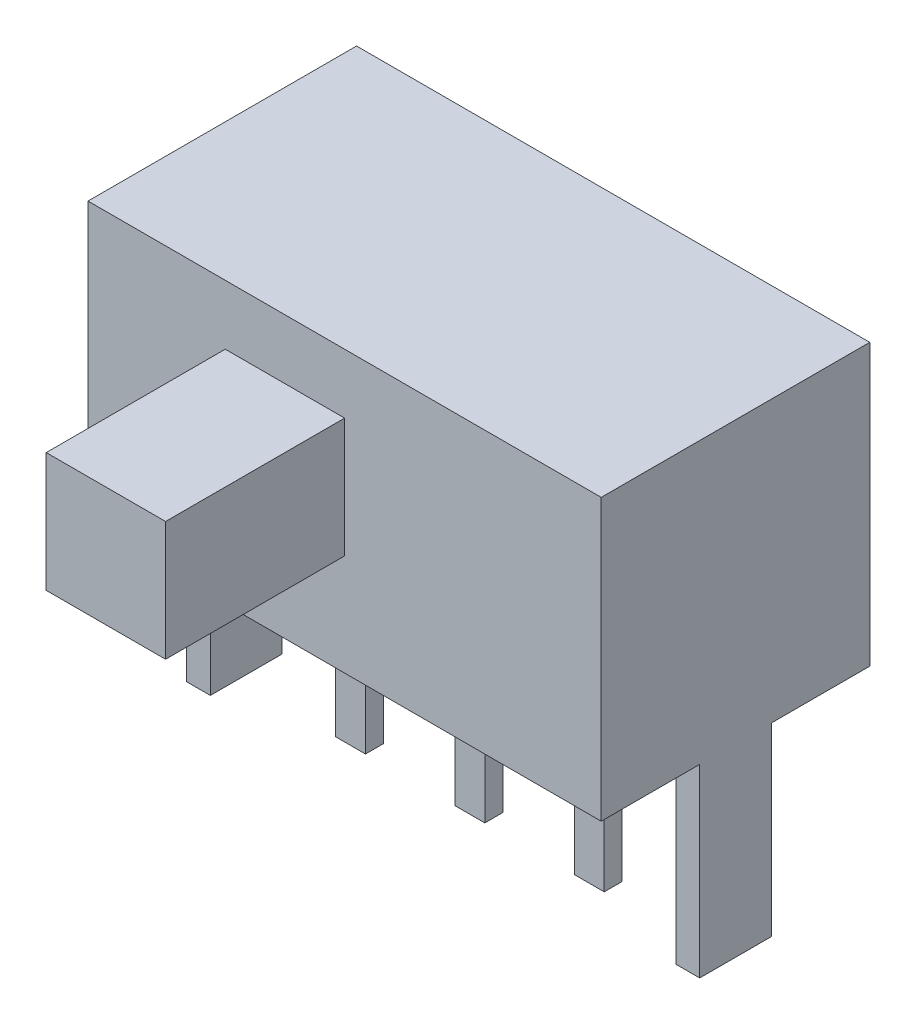
ISO-10303-21;
HEADER;
FILE_DESCRIPTION(('STEP AP214'),'2;1');
FILE_NAME('part.step','',(''),(''),'','','');
FILE_SCHEMA(('AUTOMOTIVE_DESIGN { 1 0 10303 214 1 1 1 1 }'));
ENDSEC;
DATA;
#1=APPLICATION_CONTEXT('core data for automotive mechanical design processes');
#2=APPLICATION_PROTOCOL_DEFINITION('international standard','automotive_design',2000,#1);
#3=PRODUCT_CONTEXT('',#1,'mechanical');
#4=PRODUCT('Part','Part','',(#3));
#5=PRODUCT_RELATED_PRODUCT_CATEGORY('part','',(#4));
#6=PRODUCT_DEFINITION_FORMATION('','',#4);
#7=PRODUCT_DEFINITION_CONTEXT('part definition',#1,'design');
#8=PRODUCT_DEFINITION('design','',#6,#7);
#9=PRODUCT_DEFINITION_SHAPE('','',#8);
#10=(LENGTH_UNIT() NAMED_UNIT(*) SI_UNIT(.MILLI.,.METRE.));
#11=(NAMED_UNIT(*) PLANE_ANGLE_UNIT() SI_UNIT($,.RADIAN.));
#12=(NAMED_UNIT(*) SI_UNIT($,.STERADIAN.) SOLID_ANGLE_UNIT());
#13=UNCERTAINTY_MEASURE_WITH_UNIT(LENGTH_MEASURE(1.E-05),#10,'distance_accuracy_value','');
#14=(GEOMETRIC_REPRESENTATION_CONTEXT(3) GLOBAL_UNCERTAINTY_ASSIGNED_CONTEXT((#13)) GLOBAL_UNIT_ASSIGNED_CONTEXT((#10,
#11,#12)) REPRESENTATION_CONTEXT('',''));
#15=CARTESIAN_POINT('',(0.,0.,0.));
#16=DIRECTION('',(0.,0.,1.));
#17=DIRECTION('',(1.,0.,0.));
#18=AXIS2_PLACEMENT_3D('',#15,#16,#17);
#19=CARTESIAN_POINT('',(0.,0.,0.));
#20=DIRECTION('',(0.,-1.,0.));
#21=DIRECTION('',(0.,0.,-1.));
#22=AXIS2_PLACEMENT_3D('',#19,#20,#21);
#23=PLANE('',#22);
#24=DIRECTION('',(0.,0.,-1.));
#25=VECTOR('',#24,1.);
#26=CARTESIAN_POINT('',(8.2,0.,-1.65));
#27=LINE('',#26,#25);
#28=CARTESIAN_POINT('',(8.2,0.,-1.65));
#29=VERTEX_POINT('',#28);
#30=CARTESIAN_POINT('',(8.2,0.,-2.85));
#31=VERTEX_POINT('',#30);
#32=EDGE_CURVE('E327',#29,#31,#27,.T.);
#33=ORIENTED_EDGE('',*,*,#32,.F.);
#34=DIRECTION('',(-1.,0.,0.));
#35=VECTOR('',#34,1.);
#36=CARTESIAN_POINT('',(8.6,0.,-1.65));
#37=LINE('',#36,#35);
#38=CARTESIAN_POINT('',(8.6,0.,-1.65));
#39=VERTEX_POINT('',#38);
#40=EDGE_CURVE('E331',#39,#29,#37,.T.);
#41=ORIENTED_EDGE('',*,*,#40,.F.);
#42=DIRECTION('',(0.,0.,-1.));
#43=VECTOR('',#42,1.);
#44=CARTESIAN_POINT('',(8.6,0.,0.));
#45=LINE('',#44,#43);
#46=CARTESIAN_POINT('',(8.6,0.,0.));
#47=VERTEX_POINT('',#46);
#48=EDGE_CURVE('E421',#47,#39,#45,.T.);
#49=ORIENTED_EDGE('',*,*,#48,.F.);
#50=DIRECTION('',(1.,0.,0.));
#51=VECTOR('',#50,1.);
#52=CARTESIAN_POINT('',(0.,0.,0.));
#53=LINE('',#52,#51);
#54=CARTESIAN_POINT('',(0.,0.,0.));
#55=VERTEX_POINT('',#54);
#56=EDGE_CURVE('E418',#55,#47,#53,.T.);
#57=ORIENTED_EDGE('',*,*,#56,.F.);
#58=DIRECTION('',(0.,0.,1.));
#59=VECTOR('',#58,1.);
#60=CARTESIAN_POINT('',(0.,0.,0.));
#61=LINE('',#60,#59);
#62=CARTESIAN_POINT('',(0.,0.,-1.65));
#63=VERTEX_POINT('',#62);
#64=EDGE_CURVE('E403',#63,#55,#61,.T.);
#65=ORIENTED_EDGE('',*,*,#64,.F.);
#66=DIRECTION('',(-1.,0.,0.));
#67=VECTOR('',#66,1.);
#68=CARTESIAN_POINT('',(0.,0.,-1.65));
#69=LINE('',#68,#67);
#70=CARTESIAN_POINT('',(0.4,0.,-1.65));
#71=VERTEX_POINT('',#70);
#72=EDGE_CURVE('E345',#71,#63,#69,.T.);
#73=ORIENTED_EDGE('',*,*,#72,.F.);
#74=DIRECTION('',(0.,0.,1.));
#75=VECTOR('',#74,1.);
#76=CARTESIAN_POINT('',(0.4,0.,-1.65));
#77=LINE('',#76,#75);
#78=CARTESIAN_POINT('',(0.4,0.,-2.85));
#79=VERTEX_POINT('',#78);
#80=EDGE_CURVE('E354',#79,#71,#77,.T.);
#81=ORIENTED_EDGE('',*,*,#80,.F.);
#82=DIRECTION('',(1.,0.,0.));
#83=VECTOR('',#82,1.);
#84=CARTESIAN_POINT('',(0.,0.,-2.85));
#85=LINE('',#84,#83);
#86=CARTESIAN_POINT('',(0.,0.,-2.85));
#87=VERTEX_POINT('',#86);
#88=EDGE_CURVE('E333',#87,#79,#85,.T.);
#89=ORIENTED_EDGE('',*,*,#88,.F.);
#90=CARTESIAN_POINT('',(0.,0.,-4.5));
#91=VERTEX_POINT('',#90);
#92=EDGE_CURVE('E415',#91,#87,#61,.T.);
#93=ORIENTED_EDGE('',*,*,#92,.F.);
#94=DIRECTION('',(-1.,0.,0.));
#95=VECTOR('',#94,1.);
#96=CARTESIAN_POINT('',(0.,0.,-4.5));
#97=LINE('',#96,#95);
#98=CARTESIAN_POINT('',(8.6,0.,-4.5));
#99=VERTEX_POINT('',#98);
#100=EDGE_CURVE('E408',#99,#91,#97,.T.);
#101=ORIENTED_EDGE('',*,*,#100,.F.);
#102=CARTESIAN_POINT('',(8.6,0.,-2.85));
#103=VERTEX_POINT('',#102);
#104=EDGE_CURVE('E420',#103,#99,#45,.T.);
#105=ORIENTED_EDGE('',*,*,#104,.F.);
#106=DIRECTION('',(1.,0.,0.));
#107=VECTOR('',#106,1.);
#108=CARTESIAN_POINT('',(8.6,0.,-2.85));
#109=LINE('',#108,#107);
#110=EDGE_CURVE('E325',#31,#103,#109,.T.);
#111=ORIENTED_EDGE('',*,*,#110,.F.);
#112=EDGE_LOOP('',(#33,#41,#49,#57,#65,#73,#81,#89,#93,#101,#105,#111));
#113=FACE_BOUND('',#112,.T.);
#114=DIRECTION('',(1.,0.,0.));
#115=VECTOR('',#114,1.);
#116=CARTESIAN_POINT('',(4.05,0.,-2.4));
#117=LINE('',#116,#115);
#118=CARTESIAN_POINT('',(4.05,0.,-2.4));
#119=VERTEX_POINT('',#118);
#120=CARTESIAN_POINT('',(4.55,0.,-2.4));
#121=VERTEX_POINT('',#120);
#122=EDGE_CURVE('E299',#119,#121,#117,.T.);
#123=ORIENTED_EDGE('',*,*,#122,.F.);
#124=DIRECTION('',(0.,0.,-1.));
#125=VECTOR('',#124,1.);
#126=CARTESIAN_POINT('',(4.05,0.,-2.1));
#127=LINE('',#126,#125);
#128=CARTESIAN_POINT('',(4.05,0.,-2.1));
#129=VERTEX_POINT('',#128);
#130=EDGE_CURVE('E278',#129,#119,#127,.T.);
#131=ORIENTED_EDGE('',*,*,#130,.F.);
#132=DIRECTION('',(-1.,0.,0.));
#133=VECTOR('',#132,1.);
#134=CARTESIAN_POINT('',(4.05,0.,-2.1));
#135=LINE('',#134,#133);
#136=CARTESIAN_POINT('',(4.55,0.,-2.1));
#137=VERTEX_POINT('',#136);
#138=EDGE_CURVE('E290',#137,#129,#135,.T.);
#139=ORIENTED_EDGE('',*,*,#138,.F.);
#140=DIRECTION('',(0.,0.,1.));
#141=VECTOR('',#140,1.);
#142=CARTESIAN_POINT('',(4.55,0.,-2.1));
#143=LINE('',#142,#141);
#144=EDGE_CURVE('E301',#121,#137,#143,.T.);
#145=ORIENTED_EDGE('',*,*,#144,.F.);
#146=EDGE_LOOP('',(#123,#131,#139,#145));
#147=FACE_BOUND('',#146,.T.);
#148=DIRECTION('',(0.,0.,-1.));
#149=VECTOR('',#148,1.);
#150=CARTESIAN_POINT('',(6.05,0.,-2.1));
#151=LINE('',#150,#149);
#152=CARTESIAN_POINT('',(6.05,0.,-2.1));
#153=VERTEX_POINT('',#152);
#154=CARTESIAN_POINT('',(6.05,0.,-2.4));
#155=VERTEX_POINT('',#154);
#156=EDGE_CURVE('E273',#153,#155,#151,.T.);
#157=ORIENTED_EDGE('',*,*,#156,.F.);
#158=DIRECTION('',(-1.,0.,0.));
#159=VECTOR('',#158,1.);
#160=CARTESIAN_POINT('',(6.05,0.,-2.1));
#161=LINE('',#160,#159);
#162=CARTESIAN_POINT('',(6.55,0.,-2.1));
#163=VERTEX_POINT('',#162);
#164=EDGE_CURVE('E275',#163,#153,#161,.T.);
#165=ORIENTED_EDGE('',*,*,#164,.F.);
#166=DIRECTION('',(0.,0.,1.));
#167=VECTOR('',#166,1.);
#168=CARTESIAN_POINT('',(6.55,0.,-2.1));
#169=LINE('',#168,#167);
#170=CARTESIAN_POINT('',(6.55,0.,-2.4));
#171=VERTEX_POINT('',#170);
#172=EDGE_CURVE('E268',#171,#163,#169,.T.);
#173=ORIENTED_EDGE('',*,*,#172,.F.);
#174=DIRECTION('',(1.,0.,0.));
#175=VECTOR('',#174,1.);
#176=CARTESIAN_POINT('',(6.05,0.,-2.4));
#177=LINE('',#176,#175);
#178=EDGE_CURVE('E270',#155,#171,#177,.T.);
#179=ORIENTED_EDGE('',*,*,#178,.F.);
#180=EDGE_LOOP('',(#157,#165,#173,#179));
#181=FACE_BOUND('',#180,.T.);
#182=DIRECTION('',(-1.,0.,0.));
#183=VECTOR('',#182,1.);
#184=CARTESIAN_POINT('',(2.55,0.,-2.1));
#185=LINE('',#184,#183);
#186=CARTESIAN_POINT('',(2.55,0.,-2.1));
#187=VERTEX_POINT('',#186);
#188=CARTESIAN_POINT('',(2.05,0.,-2.1));
#189=VERTEX_POINT('',#188);
#190=EDGE_CURVE('E247',#187,#189,#185,.T.);
#191=ORIENTED_EDGE('',*,*,#190,.F.);
#192=DIRECTION('',(0.,0.,1.));
#193=VECTOR('',#192,1.);
#194=CARTESIAN_POINT('',(2.55,0.,-2.1));
#195=LINE('',#194,#193);
#196=CARTESIAN_POINT('',(2.55,0.,-2.4));
#197=VERTEX_POINT('',#196);
#198=EDGE_CURVE('E242',#197,#187,#195,.T.);
#199=ORIENTED_EDGE('',*,*,#198,.F.);
#200=DIRECTION('',(1.,0.,0.));
#201=VECTOR('',#200,1.);
#202=CARTESIAN_POINT('',(2.55,0.,-2.4));
#203=LINE('',#202,#201);
#204=CARTESIAN_POINT('',(2.05,0.,-2.4));
#205=VERTEX_POINT('',#204);
#206=EDGE_CURVE('E227',#205,#197,#203,.T.);
#207=ORIENTED_EDGE('',*,*,#206,.F.);
#208=DIRECTION('',(0.,0.,-1.));
#209=VECTOR('',#208,1.);
#210=CARTESIAN_POINT('',(2.05,0.,-2.1));
#211=LINE('',#210,#209);
#212=EDGE_CURVE('E235',#189,#205,#211,.T.);
#213=ORIENTED_EDGE('',*,*,#212,.F.);
#214=EDGE_LOOP('',(#191,#199,#207,#213));
#215=FACE_BOUND('',#214,.T.);
#216=ADVANCED_FACE('F41',(#113,#147,#181,#215),#23,.T.);
#217=CARTESIAN_POINT('',(0.,4.7,0.));
#218=DIRECTION('',(0.,0.,-1.));
#219=DIRECTION('',(-1.,0.,0.));
#220=AXIS2_PLACEMENT_3D('',#217,#218,#219);
#221=PLANE('',#220);
#222=ORIENTED_EDGE('',*,*,#56,.T.);
#223=DIRECTION('',(0.,-1.,0.));
#224=VECTOR('',#223,1.);
#225=CARTESIAN_POINT('',(8.6,4.7,0.));
#226=LINE('',#225,#224);
#227=CARTESIAN_POINT('',(8.6,4.7,0.));
#228=VERTEX_POINT('',#227);
#229=EDGE_CURVE('E49',#228,#47,#226,.T.);
#230=ORIENTED_EDGE('',*,*,#229,.F.);
#231=DIRECTION('',(1.,0.,0.));
#232=VECTOR('',#231,1.);
#233=CARTESIAN_POINT('',(0.,4.7,0.));
#234=LINE('',#233,#232);
#235=CARTESIAN_POINT('',(0.,4.7,0.));
#236=VERTEX_POINT('',#235);
#237=EDGE_CURVE('E407',#236,#228,#234,.T.);
#238=ORIENTED_EDGE('',*,*,#237,.F.);
#239=DIRECTION('',(0.,-1.,0.));
#240=VECTOR('',#239,1.);
#241=CARTESIAN_POINT('',(0.,4.7,0.));
#242=LINE('',#241,#240);
#243=EDGE_CURVE('E11',#236,#55,#242,.T.);
#244=ORIENTED_EDGE('',*,*,#243,.T.);
#245=EDGE_LOOP('',(#222,#230,#238,#244));
#246=FACE_BOUND('',#245,.T.);
#247=DIRECTION('',(0.,-1.,0.));
#248=VECTOR('',#247,1.);
#249=CARTESIAN_POINT('',(2.3,3.7,0.));
#250=LINE('',#249,#248);
#251=CARTESIAN_POINT('',(2.3,3.7,0.));
#252=VERTEX_POINT('',#251);
#253=CARTESIAN_POINT('',(2.3,1.7,0.));
#254=VERTEX_POINT('',#253);
#255=EDGE_CURVE('E370',#252,#254,#250,.T.);
#256=ORIENTED_EDGE('',*,*,#255,.F.);
#257=DIRECTION('',(-1.,0.,0.));
#258=VECTOR('',#257,1.);
#259=CARTESIAN_POINT('',(2.3,3.7,0.));
#260=LINE('',#259,#258);
#261=CARTESIAN_POINT('',(4.3,3.7,0.));
#262=VERTEX_POINT('',#261);
#263=EDGE_CURVE('E375',#262,#252,#260,.T.);
#264=ORIENTED_EDGE('',*,*,#263,.F.);
#265=DIRECTION('',(0.,1.,0.));
#266=VECTOR('',#265,1.);
#267=CARTESIAN_POINT('',(4.3,3.7,0.));
#268=LINE('',#267,#266);
#269=CARTESIAN_POINT('',(4.3,1.7,0.));
#270=VERTEX_POINT('',#269);
#271=EDGE_CURVE('E387',#270,#262,#268,.T.);
#272=ORIENTED_EDGE('',*,*,#271,.F.);
#273=DIRECTION('',(1.,0.,0.));
#274=VECTOR('',#273,1.);
#275=CARTESIAN_POINT('',(2.3,1.7,0.));
#276=LINE('',#275,#274);
#277=EDGE_CURVE('E384',#254,#270,#276,.T.);
#278=ORIENTED_EDGE('',*,*,#277,.F.);
#279=EDGE_LOOP('',(#256,#264,#272,#278));
#280=FACE_BOUND('',#279,.T.);
#281=ADVANCED_FACE('F470',(#246,#280),#221,.F.);
#282=CARTESIAN_POINT('',(0.,4.7,0.));
#283=DIRECTION('',(1.,0.,0.));
#284=DIRECTION('',(0.,0.,-1.));
#285=AXIS2_PLACEMENT_3D('',#282,#283,#284);
#286=PLANE('',#285);
#287=ORIENTED_EDGE('',*,*,#92,.T.);
#288=DIRECTION('',(0.,1.,0.));
#289=VECTOR('',#288,1.);
#290=CARTESIAN_POINT('',(0.,-3.1,-2.85));
#291=LINE('',#290,#289);
#292=CARTESIAN_POINT('',(0.,-3.1,-2.85));
#293=VERTEX_POINT('',#292);
#294=EDGE_CURVE('E367',#293,#87,#291,.T.);
#295=ORIENTED_EDGE('',*,*,#294,.F.);
#296=DIRECTION('',(0.,0.,-1.));
#297=VECTOR('',#296,1.);
#298=CARTESIAN_POINT('',(0.,-3.1,-1.65));
#299=LINE('',#298,#297);
#300=CARTESIAN_POINT('',(0.,-3.1,-1.65));
#301=VERTEX_POINT('',#300);
#302=EDGE_CURVE('E341',#301,#293,#299,.T.);
#303=ORIENTED_EDGE('',*,*,#302,.F.);
#304=DIRECTION('',(0.,1.,0.));
#305=VECTOR('',#304,1.);
#306=CARTESIAN_POINT('',(0.,-3.1,-1.65));
#307=LINE('',#306,#305);
#308=EDGE_CURVE('E351',#301,#63,#307,.T.);
#309=ORIENTED_EDGE('',*,*,#308,.T.);
#310=ORIENTED_EDGE('',*,*,#64,.T.);
#311=ORIENTED_EDGE('',*,*,#243,.F.);
#312=DIRECTION('',(0.,0.,1.));
#313=VECTOR('',#312,1.);
#314=CARTESIAN_POINT('',(0.,4.7,0.));
#315=LINE('',#314,#313);
#316=CARTESIAN_POINT('',(0.,4.7,-4.5));
#317=VERTEX_POINT('',#316);
#318=EDGE_CURVE('E404',#317,#236,#315,.T.);
#319=ORIENTED_EDGE('',*,*,#318,.F.);
#320=DIRECTION('',(0.,-1.,0.));
#321=VECTOR('',#320,1.);
#322=CARTESIAN_POINT('',(0.,4.7,-4.5));
#323=LINE('',#322,#321);
#324=EDGE_CURVE('E414',#317,#91,#323,.T.);
#325=ORIENTED_EDGE('',*,*,#324,.T.);
#326=EDGE_LOOP('',(#287,#295,#303,#309,#310,#311,#319,#325));
#327=FACE_BOUND('',#326,.T.);
#328=ADVANCED_FACE('F43',(#327),#286,.F.);
#329=CARTESIAN_POINT('',(8.6,4.7,0.));
#330=DIRECTION('',(-1.,0.,0.));
#331=DIRECTION('',(0.,0.,1.));
#332=AXIS2_PLACEMENT_3D('',#329,#330,#331);
#333=PLANE('',#332);
#334=ORIENTED_EDGE('',*,*,#48,.T.);
#335=DIRECTION('',(0.,1.,0.));
#336=VECTOR('',#335,1.);
#337=CARTESIAN_POINT('',(8.6,-3.1,-1.65));
#338=LINE('',#337,#336);
#339=CARTESIAN_POINT('',(8.6,-3.1,-1.65));
#340=VERTEX_POINT('',#339);
#341=EDGE_CURVE('E314',#340,#39,#338,.T.);
#342=ORIENTED_EDGE('',*,*,#341,.F.);
#343=DIRECTION('',(0.,0.,1.));
#344=VECTOR('',#343,1.);
#345=CARTESIAN_POINT('',(8.6,-3.1,-1.65));
#346=LINE('',#345,#344);
#347=CARTESIAN_POINT('',(8.6,-3.1,-2.85));
#348=VERTEX_POINT('',#347);
#349=EDGE_CURVE('E328',#348,#340,#346,.T.);
#350=ORIENTED_EDGE('',*,*,#349,.F.);
#351=DIRECTION('',(0.,1.,0.));
#352=VECTOR('',#351,1.);
#353=CARTESIAN_POINT('',(8.6,-3.1,-2.85));
#354=LINE('',#353,#352);
#355=EDGE_CURVE('E321',#348,#103,#354,.T.);
#356=ORIENTED_EDGE('',*,*,#355,.T.);
#357=ORIENTED_EDGE('',*,*,#104,.T.);
#358=DIRECTION('',(0.,-1.,0.));
#359=VECTOR('',#358,1.);
#360=CARTESIAN_POINT('',(8.6,4.7,-4.5));
#361=LINE('',#360,#359);
#362=CARTESIAN_POINT('',(8.6,4.7,-4.5));
#363=VERTEX_POINT('',#362);
#364=EDGE_CURVE('E427',#363,#99,#361,.T.);
#365=ORIENTED_EDGE('',*,*,#364,.F.);
#366=DIRECTION('',(0.,0.,-1.));
#367=VECTOR('',#366,1.);
#368=CARTESIAN_POINT('',(8.6,4.7,0.));
#369=LINE('',#368,#367);
#370=EDGE_CURVE('E410',#228,#363,#369,.T.);
#371=ORIENTED_EDGE('',*,*,#370,.F.);
#372=ORIENTED_EDGE('',*,*,#229,.T.);
#373=EDGE_LOOP('',(#334,#342,#350,#356,#357,#365,#371,#372));
#374=FACE_BOUND('',#373,.T.);
#375=ADVANCED_FACE('F434',(#374),#333,.F.);
#376=CARTESIAN_POINT('',(0.,4.7,-4.5));
#377=DIRECTION('',(0.,0.,1.));
#378=DIRECTION('',(1.,0.,0.));
#379=AXIS2_PLACEMENT_3D('',#376,#377,#378);
#380=PLANE('',#379);
#381=ORIENTED_EDGE('',*,*,#100,.T.);
#382=ORIENTED_EDGE('',*,*,#324,.F.);
#383=DIRECTION('',(-1.,0.,0.));
#384=VECTOR('',#383,1.);
#385=CARTESIAN_POINT('',(0.,4.7,-4.5));
#386=LINE('',#385,#384);
#387=EDGE_CURVE('E412',#363,#317,#386,.T.);
#388=ORIENTED_EDGE('',*,*,#387,.F.);
#389=ORIENTED_EDGE('',*,*,#364,.T.);
#390=EDGE_LOOP('',(#381,#382,#388,#389));
#391=FACE_BOUND('',#390,.T.);
#392=ADVANCED_FACE('F462',(#391),#380,.F.);
#393=CARTESIAN_POINT('',(0.,4.7,0.));
#394=DIRECTION('',(0.,-1.,0.));
#395=DIRECTION('',(0.,0.,-1.));
#396=AXIS2_PLACEMENT_3D('',#393,#394,#395);
#397=PLANE('',#396);
#398=ORIENTED_EDGE('',*,*,#318,.T.);
#399=ORIENTED_EDGE('',*,*,#237,.T.);
#400=ORIENTED_EDGE('',*,*,#370,.T.);
#401=ORIENTED_EDGE('',*,*,#387,.T.);
#402=EDGE_LOOP('',(#398,#399,#400,#401));
#403=FACE_BOUND('',#402,.T.);
#404=ADVANCED_FACE('F469',(#403),#397,.F.);
#405=CARTESIAN_POINT('',(2.3,3.7,3.));
#406=DIRECTION('',(1.,0.,0.));
#407=DIRECTION('',(0.,1.,0.));
#408=AXIS2_PLACEMENT_3D('',#405,#406,#407);
#409=PLANE('',#408);
#410=ORIENTED_EDGE('',*,*,#255,.T.);
#411=DIRECTION('',(0.,0.,-1.));
#412=VECTOR('',#411,1.);
#413=CARTESIAN_POINT('',(2.3,1.7,3.));
#414=LINE('',#413,#412);
#415=CARTESIAN_POINT('',(2.3,1.7,3.));
#416=VERTEX_POINT('',#415);
#417=EDGE_CURVE('E400',#416,#254,#414,.T.);
#418=ORIENTED_EDGE('',*,*,#417,.F.);
#419=DIRECTION('',(0.,-1.,0.));
#420=VECTOR('',#419,1.);
#421=CARTESIAN_POINT('',(2.3,3.7,3.));
#422=LINE('',#421,#420);
#423=CARTESIAN_POINT('',(2.3,3.7,3.));
#424=VERTEX_POINT('',#423);
#425=EDGE_CURVE('E371',#424,#416,#422,.T.);
#426=ORIENTED_EDGE('',*,*,#425,.F.);
#427=DIRECTION('',(0.,0.,-1.));
#428=VECTOR('',#427,1.);
#429=CARTESIAN_POINT('',(2.3,3.7,3.));
#430=LINE('',#429,#428);
#431=EDGE_CURVE('E381',#424,#252,#430,.T.);
#432=ORIENTED_EDGE('',*,*,#431,.T.);
#433=EDGE_LOOP('',(#410,#418,#426,#432));
#434=FACE_BOUND('',#433,.T.);
#435=ADVANCED_FACE('F481',(#434),#409,.F.);
#436=CARTESIAN_POINT('',(2.3,1.7,3.));
#437=DIRECTION('',(0.,1.,0.));
#438=DIRECTION('',(0.,0.,1.));
#439=AXIS2_PLACEMENT_3D('',#436,#437,#438);
#440=PLANE('',#439);
#441=ORIENTED_EDGE('',*,*,#277,.T.);
#442=DIRECTION('',(0.,0.,-1.));
#443=VECTOR('',#442,1.);
#444=CARTESIAN_POINT('',(4.3,1.7,3.));
#445=LINE('',#444,#443);
#446=CARTESIAN_POINT('',(4.3,1.7,3.));
#447=VERTEX_POINT('',#446);
#448=EDGE_CURVE('E397',#447,#270,#445,.T.);
#449=ORIENTED_EDGE('',*,*,#448,.F.);
#450=DIRECTION('',(1.,0.,0.));
#451=VECTOR('',#450,1.);
#452=CARTESIAN_POINT('',(2.3,1.7,3.));
#453=LINE('',#452,#451);
#454=EDGE_CURVE('E374',#416,#447,#453,.T.);
#455=ORIENTED_EDGE('',*,*,#454,.F.);
#456=ORIENTED_EDGE('',*,*,#417,.T.);
#457=EDGE_LOOP('',(#441,#449,#455,#456));
#458=FACE_BOUND('',#457,.T.);
#459=ADVANCED_FACE('F489',(#458),#440,.F.);
#460=CARTESIAN_POINT('',(4.3,3.7,3.));
#461=DIRECTION('',(-1.,0.,0.));
#462=DIRECTION('',(0.,0.,1.));
#463=AXIS2_PLACEMENT_3D('',#460,#461,#462);
#464=PLANE('',#463);
#465=ORIENTED_EDGE('',*,*,#271,.T.);
#466=DIRECTION('',(0.,0.,-1.));
#467=VECTOR('',#466,1.);
#468=CARTESIAN_POINT('',(4.3,3.7,3.));
#469=LINE('',#468,#467);
#470=CARTESIAN_POINT('',(4.3,3.7,3.));
#471=VERTEX_POINT('',#470);
#472=EDGE_CURVE('E394',#471,#262,#469,.T.);
#473=ORIENTED_EDGE('',*,*,#472,.F.);
#474=DIRECTION('',(0.,1.,0.));
#475=VECTOR('',#474,1.);
#476=CARTESIAN_POINT('',(4.3,3.7,3.));
#477=LINE('',#476,#475);
#478=EDGE_CURVE('E377',#447,#471,#477,.T.);
#479=ORIENTED_EDGE('',*,*,#478,.F.);
#480=ORIENTED_EDGE('',*,*,#448,.T.);
#481=EDGE_LOOP('',(#465,#473,#479,#480));
#482=FACE_BOUND('',#481,.T.);
#483=ADVANCED_FACE('F487',(#482),#464,.F.);
#484=CARTESIAN_POINT('',(2.3,3.7,3.));
#485=DIRECTION('',(0.,-1.,0.));
#486=DIRECTION('',(0.,0.,-1.));
#487=AXIS2_PLACEMENT_3D('',#484,#485,#486);
#488=PLANE('',#487);
#489=ORIENTED_EDGE('',*,*,#263,.T.);
#490=ORIENTED_EDGE('',*,*,#431,.F.);
#491=DIRECTION('',(-1.,0.,0.));
#492=VECTOR('',#491,1.);
#493=CARTESIAN_POINT('',(2.3,3.7,3.));
#494=LINE('',#493,#492);
#495=EDGE_CURVE('E379',#471,#424,#494,.T.);
#496=ORIENTED_EDGE('',*,*,#495,.F.);
#497=ORIENTED_EDGE('',*,*,#472,.T.);
#498=EDGE_LOOP('',(#489,#490,#496,#497));
#499=FACE_BOUND('',#498,.T.);
#500=ADVANCED_FACE('F477',(#499),#488,.F.);
#501=CARTESIAN_POINT('',(0.,0.,3.));
#502=DIRECTION('',(0.,0.,1.));
#503=DIRECTION('',(1.,0.,0.));
#504=AXIS2_PLACEMENT_3D('',#501,#502,#503);
#505=PLANE('',#504);
#506=ORIENTED_EDGE('',*,*,#425,.T.);
#507=ORIENTED_EDGE('',*,*,#454,.T.);
#508=ORIENTED_EDGE('',*,*,#478,.T.);
#509=ORIENTED_EDGE('',*,*,#495,.T.);
#510=EDGE_LOOP('',(#506,#507,#508,#509));
#511=FACE_BOUND('',#510,.T.);
#512=ADVANCED_FACE('F483',(#511),#505,.T.);
#513=CARTESIAN_POINT('',(0.,-3.1,-2.85));
#514=DIRECTION('',(0.,0.,1.));
#515=DIRECTION('',(1.,0.,0.));
#516=AXIS2_PLACEMENT_3D('',#513,#514,#515);
#517=PLANE('',#516);
#518=ORIENTED_EDGE('',*,*,#88,.T.);
#519=DIRECTION('',(0.,1.,0.));
#520=VECTOR('',#519,1.);
#521=CARTESIAN_POINT('',(0.4,-3.1,-2.85));
#522=LINE('',#521,#520);
#523=CARTESIAN_POINT('',(0.4,-3.1,-2.85));
#524=VERTEX_POINT('',#523);
#525=EDGE_CURVE('E364',#524,#79,#522,.T.);
#526=ORIENTED_EDGE('',*,*,#525,.F.);
#527=DIRECTION('',(1.,0.,0.));
#528=VECTOR('',#527,1.);
#529=CARTESIAN_POINT('',(0.,-3.1,-2.85));
#530=LINE('',#529,#528);
#531=EDGE_CURVE('E344',#293,#524,#530,.T.);
#532=ORIENTED_EDGE('',*,*,#531,.F.);
#533=ORIENTED_EDGE('',*,*,#294,.T.);
#534=EDGE_LOOP('',(#518,#526,#532,#533));
#535=FACE_BOUND('',#534,.T.);
#536=ADVANCED_FACE('F558',(#535),#517,.F.);
#537=CARTESIAN_POINT('',(0.4,-3.1,-1.65));
#538=DIRECTION('',(-1.,0.,0.));
#539=DIRECTION('',(0.,0.,1.));
#540=AXIS2_PLACEMENT_3D('',#537,#538,#539);
#541=PLANE('',#540);
#542=ORIENTED_EDGE('',*,*,#80,.T.);
#543=DIRECTION('',(0.,1.,0.));
#544=VECTOR('',#543,1.);
#545=CARTESIAN_POINT('',(0.4,-3.1,-1.65));
#546=LINE('',#545,#544);
#547=CARTESIAN_POINT('',(0.4,-3.1,-1.65));
#548=VERTEX_POINT('',#547);
#549=EDGE_CURVE('E361',#548,#71,#546,.T.);
#550=ORIENTED_EDGE('',*,*,#549,.F.);
#551=DIRECTION('',(0.,0.,1.));
#552=VECTOR('',#551,1.);
#553=CARTESIAN_POINT('',(0.4,-3.1,-1.65));
#554=LINE('',#553,#552);
#555=EDGE_CURVE('E347',#524,#548,#554,.T.);
#556=ORIENTED_EDGE('',*,*,#555,.F.);
#557=ORIENTED_EDGE('',*,*,#525,.T.);
#558=EDGE_LOOP('',(#542,#550,#556,#557));
#559=FACE_BOUND('',#558,.T.);
#560=ADVANCED_FACE('F568',(#559),#541,.F.);
#561=CARTESIAN_POINT('',(0.,-3.1,-1.65));
#562=DIRECTION('',(0.,0.,-1.));
#563=DIRECTION('',(-1.,0.,0.));
#564=AXIS2_PLACEMENT_3D('',#561,#562,#563);
#565=PLANE('',#564);
#566=ORIENTED_EDGE('',*,*,#72,.T.);
#567=ORIENTED_EDGE('',*,*,#308,.F.);
#568=DIRECTION('',(-1.,0.,0.));
#569=VECTOR('',#568,1.);
#570=CARTESIAN_POINT('',(0.,-3.1,-1.65));
#571=LINE('',#570,#569);
#572=EDGE_CURVE('E349',#548,#301,#571,.T.);
#573=ORIENTED_EDGE('',*,*,#572,.F.);
#574=ORIENTED_EDGE('',*,*,#549,.T.);
#575=EDGE_LOOP('',(#566,#567,#573,#574));
#576=FACE_BOUND('',#575,.T.);
#577=ADVANCED_FACE('F576',(#576),#565,.F.);
#578=CARTESIAN_POINT('',(0.,-3.1,0.));
#579=DIRECTION('',(0.,-1.,0.));
#580=DIRECTION('',(0.,0.,-1.));
#581=AXIS2_PLACEMENT_3D('',#578,#579,#580);
#582=PLANE('',#581);
#583=ORIENTED_EDGE('',*,*,#302,.T.);
#584=ORIENTED_EDGE('',*,*,#531,.T.);
#585=ORIENTED_EDGE('',*,*,#555,.T.);
#586=ORIENTED_EDGE('',*,*,#572,.T.);
#587=EDGE_LOOP('',(#583,#584,#585,#586));
#588=FACE_BOUND('',#587,.T.);
#589=ADVANCED_FACE('F584',(#588),#582,.T.);
#590=CARTESIAN_POINT('',(8.6,-3.1,-1.65));
#591=DIRECTION('',(0.,0.,-1.));
#592=DIRECTION('',(-1.,0.,0.));
#593=AXIS2_PLACEMENT_3D('',#590,#591,#592);
#594=PLANE('',#593);
#595=ORIENTED_EDGE('',*,*,#40,.T.);
#596=DIRECTION('',(0.,1.,0.));
#597=VECTOR('',#596,1.);
#598=CARTESIAN_POINT('',(8.2,-3.1,-1.65));
#599=LINE('',#598,#597);
#600=CARTESIAN_POINT('',(8.2,-3.1,-1.65));
#601=VERTEX_POINT('',#600);
#602=EDGE_CURVE('E316',#601,#29,#599,.T.);
#603=ORIENTED_EDGE('',*,*,#602,.F.);
#604=DIRECTION('',(-1.,0.,0.));
#605=VECTOR('',#604,1.);
#606=CARTESIAN_POINT('',(8.6,-3.1,-1.65));
#607=LINE('',#606,#605);
#608=EDGE_CURVE('E337',#340,#601,#607,.T.);
#609=ORIENTED_EDGE('',*,*,#608,.F.);
#610=ORIENTED_EDGE('',*,*,#341,.T.);
#611=EDGE_LOOP('',(#595,#603,#609,#610));
#612=FACE_BOUND('',#611,.T.);
#613=ADVANCED_FACE('F446',(#612),#594,.F.);
#614=CARTESIAN_POINT('',(8.2,-3.1,-1.65));
#615=DIRECTION('',(1.,0.,0.));
#616=DIRECTION('',(0.,0.,-1.));
#617=AXIS2_PLACEMENT_3D('',#614,#615,#616);
#618=PLANE('',#617);
#619=ORIENTED_EDGE('',*,*,#32,.T.);
#620=DIRECTION('',(0.,1.,0.));
#621=VECTOR('',#620,1.);
#622=CARTESIAN_POINT('',(8.2,-3.1,-2.85));
#623=LINE('',#622,#621);
#624=CARTESIAN_POINT('',(8.2,-3.1,-2.85));
#625=VERTEX_POINT('',#624);
#626=EDGE_CURVE('E319',#625,#31,#623,.T.);
#627=ORIENTED_EDGE('',*,*,#626,.F.);
#628=DIRECTION('',(0.,0.,-1.));
#629=VECTOR('',#628,1.);
#630=CARTESIAN_POINT('',(8.2,-3.1,-1.65));
#631=LINE('',#630,#629);
#632=EDGE_CURVE('E335',#601,#625,#631,.T.);
#633=ORIENTED_EDGE('',*,*,#632,.F.);
#634=ORIENTED_EDGE('',*,*,#602,.T.);
#635=EDGE_LOOP('',(#619,#627,#633,#634));
#636=FACE_BOUND('',#635,.T.);
#637=ADVANCED_FACE('F449',(#636),#618,.F.);
#638=CARTESIAN_POINT('',(8.6,-3.1,-2.85));
#639=DIRECTION('',(0.,0.,1.));
#640=DIRECTION('',(1.,0.,0.));
#641=AXIS2_PLACEMENT_3D('',#638,#639,#640);
#642=PLANE('',#641);
#643=ORIENTED_EDGE('',*,*,#110,.T.);
#644=ORIENTED_EDGE('',*,*,#355,.F.);
#645=DIRECTION('',(1.,0.,0.));
#646=VECTOR('',#645,1.);
#647=CARTESIAN_POINT('',(8.6,-3.1,-2.85));
#648=LINE('',#647,#646);
#649=EDGE_CURVE('E324',#625,#348,#648,.T.);
#650=ORIENTED_EDGE('',*,*,#649,.F.);
#651=ORIENTED_EDGE('',*,*,#626,.T.);
#652=EDGE_LOOP('',(#643,#644,#650,#651));
#653=FACE_BOUND('',#652,.T.);
#654=ADVANCED_FACE('F605',(#653),#642,.F.);
#655=CARTESIAN_POINT('',(0.,-3.1,0.));
#656=DIRECTION('',(0.,1.,0.));
#657=DIRECTION('',(0.,0.,1.));
#658=AXIS2_PLACEMENT_3D('',#655,#656,#657);
#659=PLANE('',#658);
#660=ORIENTED_EDGE('',*,*,#349,.T.);
#661=ORIENTED_EDGE('',*,*,#608,.T.);
#662=ORIENTED_EDGE('',*,*,#632,.T.);
#663=ORIENTED_EDGE('',*,*,#649,.T.);
#664=EDGE_LOOP('',(#660,#661,#662,#663));
#665=FACE_BOUND('',#664,.T.);
#666=ADVANCED_FACE('F453',(#665),#659,.F.);
#667=CARTESIAN_POINT('',(4.05,-3.1,-2.1));
#668=DIRECTION('',(1.,0.,0.));
#669=DIRECTION('',(0.,0.,-1.));
#670=AXIS2_PLACEMENT_3D('',#667,#668,#669);
#671=PLANE('',#670);
#672=ORIENTED_EDGE('',*,*,#130,.T.);
#673=DIRECTION('',(0.,1.,0.));
#674=VECTOR('',#673,1.);
#675=CARTESIAN_POINT('',(4.05,-3.1,-2.4));
#676=LINE('',#675,#674);
#677=CARTESIAN_POINT('',(4.05,-3.1,-2.4));
#678=VERTEX_POINT('',#677);
#679=EDGE_CURVE('E312',#678,#119,#676,.T.);
#680=ORIENTED_EDGE('',*,*,#679,.F.);
#681=DIRECTION('',(0.,0.,-1.));
#682=VECTOR('',#681,1.);
#683=CARTESIAN_POINT('',(4.05,-3.1,-2.1));
#684=LINE('',#683,#682);
#685=CARTESIAN_POINT('',(4.05,-3.1,-2.1));
#686=VERTEX_POINT('',#685);
#687=EDGE_CURVE('E286',#686,#678,#684,.T.);
#688=ORIENTED_EDGE('',*,*,#687,.F.);
#689=DIRECTION('',(0.,1.,0.));
#690=VECTOR('',#689,1.);
#691=CARTESIAN_POINT('',(4.05,-3.1,-2.1));
#692=LINE('',#691,#690);
#693=EDGE_CURVE('E296',#686,#129,#692,.T.);
#694=ORIENTED_EDGE('',*,*,#693,.T.);
#695=EDGE_LOOP('',(#672,#680,#688,#694));
#696=FACE_BOUND('',#695,.T.);
#697=ADVANCED_FACE('F618',(#696),#671,.F.);
#698=CARTESIAN_POINT('',(4.05,-3.1,-2.4));
#699=DIRECTION('',(0.,0.,1.));
#700=DIRECTION('',(1.,0.,0.));
#701=AXIS2_PLACEMENT_3D('',#698,#699,#700);
#702=PLANE('',#701);
#703=ORIENTED_EDGE('',*,*,#122,.T.);
#704=DIRECTION('',(0.,1.,0.));
#705=VECTOR('',#704,1.);
#706=CARTESIAN_POINT('',(4.55,-3.1,-2.4));
#707=LINE('',#706,#705);
#708=CARTESIAN_POINT('',(4.55,-3.1,-2.4));
#709=VERTEX_POINT('',#708);
#710=EDGE_CURVE('E309',#709,#121,#707,.T.);
#711=ORIENTED_EDGE('',*,*,#710,.F.);
#712=DIRECTION('',(1.,0.,0.));
#713=VECTOR('',#712,1.);
#714=CARTESIAN_POINT('',(4.05,-3.1,-2.4));
#715=LINE('',#714,#713);
#716=EDGE_CURVE('E289',#678,#709,#715,.T.);
#717=ORIENTED_EDGE('',*,*,#716,.F.);
#718=ORIENTED_EDGE('',*,*,#679,.T.);
#719=EDGE_LOOP('',(#703,#711,#717,#718));
#720=FACE_BOUND('',#719,.T.);
#721=ADVANCED_FACE('F626',(#720),#702,.F.);
#722=CARTESIAN_POINT('',(4.55,-3.1,-2.1));
#723=DIRECTION('',(-1.,0.,0.));
#724=DIRECTION('',(0.,0.,1.));
#725=AXIS2_PLACEMENT_3D('',#722,#723,#724);
#726=PLANE('',#725);
#727=ORIENTED_EDGE('',*,*,#144,.T.);
#728=DIRECTION('',(0.,1.,0.));
#729=VECTOR('',#728,1.);
#730=CARTESIAN_POINT('',(4.55,-3.1,-2.1));
#731=LINE('',#730,#729);
#732=CARTESIAN_POINT('',(4.55,-3.1,-2.1));
#733=VERTEX_POINT('',#732);
#734=EDGE_CURVE('E307',#733,#137,#731,.T.);
#735=ORIENTED_EDGE('',*,*,#734,.F.);
#736=DIRECTION('',(0.,0.,1.));
#737=VECTOR('',#736,1.);
#738=CARTESIAN_POINT('',(4.55,-3.1,-2.1));
#739=LINE('',#738,#737);
#740=EDGE_CURVE('E292',#709,#733,#739,.T.);
#741=ORIENTED_EDGE('',*,*,#740,.F.);
#742=ORIENTED_EDGE('',*,*,#710,.T.);
#743=EDGE_LOOP('',(#727,#735,#741,#742));
#744=FACE_BOUND('',#743,.T.);
#745=ADVANCED_FACE('F634',(#744),#726,.F.);
#746=CARTESIAN_POINT('',(4.05,-3.1,-2.1));
#747=DIRECTION('',(0.,0.,-1.));
#748=DIRECTION('',(-1.,0.,0.));
#749=AXIS2_PLACEMENT_3D('',#746,#747,#748);
#750=PLANE('',#749);
#751=ORIENTED_EDGE('',*,*,#138,.T.);
#752=ORIENTED_EDGE('',*,*,#693,.F.);
#753=DIRECTION('',(-1.,0.,0.));
#754=VECTOR('',#753,1.);
#755=CARTESIAN_POINT('',(4.05,-3.1,-2.1));
#756=LINE('',#755,#754);
#757=EDGE_CURVE('E294',#733,#686,#756,.T.);
#758=ORIENTED_EDGE('',*,*,#757,.F.);
#759=ORIENTED_EDGE('',*,*,#734,.T.);
#760=EDGE_LOOP('',(#751,#752,#758,#759));
#761=FACE_BOUND('',#760,.T.);
#762=ADVANCED_FACE('F642',(#761),#750,.F.);
#763=CARTESIAN_POINT('',(0.,-3.1,0.));
#764=DIRECTION('',(0.,-1.,0.));
#765=DIRECTION('',(0.,0.,-1.));
#766=AXIS2_PLACEMENT_3D('',#763,#764,#765);
#767=PLANE('',#766);
#768=ORIENTED_EDGE('',*,*,#687,.T.);
#769=ORIENTED_EDGE('',*,*,#716,.T.);
#770=ORIENTED_EDGE('',*,*,#740,.T.);
#771=ORIENTED_EDGE('',*,*,#757,.T.);
#772=EDGE_LOOP('',(#768,#769,#770,#771));
#773=FACE_BOUND('',#772,.T.);
#774=ADVANCED_FACE('F650',(#773),#767,.T.);
#775=CARTESIAN_POINT('',(6.05,-3.1,-2.1));
#776=DIRECTION('',(0.,0.,-1.));
#777=DIRECTION('',(-1.,0.,0.));
#778=AXIS2_PLACEMENT_3D('',#775,#776,#777);
#779=PLANE('',#778);
#780=ORIENTED_EDGE('',*,*,#164,.T.);
#781=DIRECTION('',(0.,1.,0.));
#782=VECTOR('',#781,1.);
#783=CARTESIAN_POINT('',(6.05,-3.1,-2.1));
#784=LINE('',#783,#782);
#785=CARTESIAN_POINT('',(6.05,-3.1,-2.1));
#786=VERTEX_POINT('',#785);
#787=EDGE_CURVE('E248',#786,#153,#784,.T.);
#788=ORIENTED_EDGE('',*,*,#787,.F.);
#789=DIRECTION('',(-1.,0.,0.));
#790=VECTOR('',#789,1.);
#791=CARTESIAN_POINT('',(6.05,-3.1,-2.1));
#792=LINE('',#791,#790);
#793=CARTESIAN_POINT('',(6.55,-3.1,-2.1));
#794=VERTEX_POINT('',#793);
#795=EDGE_CURVE('E271',#794,#786,#792,.T.);
#796=ORIENTED_EDGE('',*,*,#795,.F.);
#797=DIRECTION('',(0.,1.,0.));
#798=VECTOR('',#797,1.);
#799=CARTESIAN_POINT('',(6.55,-3.1,-2.1));
#800=LINE('',#799,#798);
#801=EDGE_CURVE('E264',#794,#163,#800,.T.);
#802=ORIENTED_EDGE('',*,*,#801,.T.);
#803=EDGE_LOOP('',(#780,#788,#796,#802));
#804=FACE_BOUND('',#803,.T.);
#805=ADVANCED_FACE('F658',(#804),#779,.F.);
#806=CARTESIAN_POINT('',(6.05,-3.1,-2.1));
#807=DIRECTION('',(1.,0.,0.));
#808=DIRECTION('',(0.,0.,-1.));
#809=AXIS2_PLACEMENT_3D('',#806,#807,#808);
#810=PLANE('',#809);
#811=ORIENTED_EDGE('',*,*,#156,.T.);
#812=DIRECTION('',(0.,1.,0.));
#813=VECTOR('',#812,1.);
#814=CARTESIAN_POINT('',(6.05,-3.1,-2.4));
#815=LINE('',#814,#813);
#816=CARTESIAN_POINT('',(6.05,-3.1,-2.4));
#817=VERTEX_POINT('',#816);
#818=EDGE_CURVE('E250',#817,#155,#815,.T.);
#819=ORIENTED_EDGE('',*,*,#818,.F.);
#820=DIRECTION('',(0.,0.,-1.));
#821=VECTOR('',#820,1.);
#822=CARTESIAN_POINT('',(6.05,-3.1,-2.1));
#823=LINE('',#822,#821);
#824=EDGE_CURVE('E282',#786,#817,#823,.T.);
#825=ORIENTED_EDGE('',*,*,#824,.F.);
#826=ORIENTED_EDGE('',*,*,#787,.T.);
#827=EDGE_LOOP('',(#811,#819,#825,#826));
#828=FACE_BOUND('',#827,.T.);
#829=ADVANCED_FACE('F666',(#828),#810,.F.);
#830=CARTESIAN_POINT('',(6.05,-3.1,-2.4));
#831=DIRECTION('',(0.,0.,1.));
#832=DIRECTION('',(1.,0.,0.));
#833=AXIS2_PLACEMENT_3D('',#830,#831,#832);
#834=PLANE('',#833);
#835=ORIENTED_EDGE('',*,*,#178,.T.);
#836=DIRECTION('',(0.,1.,0.));
#837=VECTOR('',#836,1.);
#838=CARTESIAN_POINT('',(6.55,-3.1,-2.4));
#839=LINE('',#838,#837);
#840=CARTESIAN_POINT('',(6.55,-3.1,-2.4));
#841=VERTEX_POINT('',#840);
#842=EDGE_CURVE('E64',#841,#171,#839,.T.);
#843=ORIENTED_EDGE('',*,*,#842,.F.);
#844=DIRECTION('',(1.,0.,0.));
#845=VECTOR('',#844,1.);
#846=CARTESIAN_POINT('',(6.05,-3.1,-2.4));
#847=LINE('',#846,#845);
#848=EDGE_CURVE('E280',#817,#841,#847,.T.);
#849=ORIENTED_EDGE('',*,*,#848,.F.);
#850=ORIENTED_EDGE('',*,*,#818,.T.);
#851=EDGE_LOOP('',(#835,#843,#849,#850));
#852=FACE_BOUND('',#851,.T.);
#853=ADVANCED_FACE('F674',(#852),#834,.F.);
#854=CARTESIAN_POINT('',(6.55,-3.1,-2.1));
#855=DIRECTION('',(-1.,0.,0.));
#856=DIRECTION('',(0.,0.,1.));
#857=AXIS2_PLACEMENT_3D('',#854,#855,#856);
#858=PLANE('',#857);
#859=ORIENTED_EDGE('',*,*,#172,.T.);
#860=ORIENTED_EDGE('',*,*,#801,.F.);
#861=DIRECTION('',(0.,0.,1.));
#862=VECTOR('',#861,1.);
#863=CARTESIAN_POINT('',(6.55,-3.1,-2.1));
#864=LINE('',#863,#862);
#865=EDGE_CURVE('E267',#841,#794,#864,.T.);
#866=ORIENTED_EDGE('',*,*,#865,.F.);
#867=ORIENTED_EDGE('',*,*,#842,.T.);
#868=EDGE_LOOP('',(#859,#860,#866,#867));
#869=FACE_BOUND('',#868,.T.);
#870=ADVANCED_FACE('F682',(#869),#858,.F.);
#871=CARTESIAN_POINT('',(0.,-3.1,0.));
#872=DIRECTION('',(0.,1.,0.));
#873=DIRECTION('',(0.,0.,1.));
#874=AXIS2_PLACEMENT_3D('',#871,#872,#873);
#875=PLANE('',#874);
#876=ORIENTED_EDGE('',*,*,#795,.T.);
#877=ORIENTED_EDGE('',*,*,#824,.T.);
#878=ORIENTED_EDGE('',*,*,#848,.T.);
#879=ORIENTED_EDGE('',*,*,#865,.T.);
#880=EDGE_LOOP('',(#876,#877,#878,#879));
#881=FACE_BOUND('',#880,.T.);
#882=ADVANCED_FACE('F690',(#881),#875,.F.);
#883=CARTESIAN_POINT('',(2.55,-3.1,-2.1));
#884=DIRECTION('',(-1.,0.,0.));
#885=DIRECTION('',(0.,0.,1.));
#886=AXIS2_PLACEMENT_3D('',#883,#884,#885);
#887=PLANE('',#886);
#888=ORIENTED_EDGE('',*,*,#198,.T.);
#889=DIRECTION('',(0.,1.,0.));
#890=VECTOR('',#889,1.);
#891=CARTESIAN_POINT('',(2.55,-3.1,-2.1));
#892=LINE('',#891,#890);
#893=CARTESIAN_POINT('',(2.55,-3.1,-2.1));
#894=VERTEX_POINT('',#893);
#895=EDGE_CURVE('E870',#894,#187,#892,.T.);
#896=ORIENTED_EDGE('',*,*,#895,.F.);
#897=DIRECTION('',(0.,0.,1.));
#898=VECTOR('',#897,1.);
#899=CARTESIAN_POINT('',(2.55,-3.1,-2.1));
#900=LINE('',#899,#898);
#901=CARTESIAN_POINT('',(2.55,-3.1,-2.4));
#902=VERTEX_POINT('',#901);
#903=EDGE_CURVE('E236',#902,#894,#900,.T.);
#904=ORIENTED_EDGE('',*,*,#903,.F.);
#905=DIRECTION('',(0.,1.,0.));
#906=VECTOR('',#905,1.);
#907=CARTESIAN_POINT('',(2.55,-3.1,-2.4));
#908=LINE('',#907,#906);
#909=EDGE_CURVE('E230',#902,#197,#908,.T.);
#910=ORIENTED_EDGE('',*,*,#909,.T.);
#911=EDGE_LOOP('',(#888,#896,#904,#910));
#912=FACE_BOUND('',#911,.T.);
#913=ADVANCED_FACE('F240',(#912),#887,.F.);
#914=CARTESIAN_POINT('',(2.55,-3.1,-2.1));
#915=DIRECTION('',(0.,0.,-1.));
#916=DIRECTION('',(-1.,0.,0.));
#917=AXIS2_PLACEMENT_3D('',#914,#915,#916);
#918=PLANE('',#917);
#919=ORIENTED_EDGE('',*,*,#190,.T.);
#920=DIRECTION('',(0.,1.,0.));
#921=VECTOR('',#920,1.);
#922=CARTESIAN_POINT('',(2.05,-3.1,-2.1));
#923=LINE('',#922,#921);
#924=CARTESIAN_POINT('',(2.05,-3.1,-2.1));
#925=VERTEX_POINT('',#924);
#926=EDGE_CURVE('E871',#925,#189,#923,.T.);
#927=ORIENTED_EDGE('',*,*,#926,.F.);
#928=DIRECTION('',(-1.,0.,0.));
#929=VECTOR('',#928,1.);
#930=CARTESIAN_POINT('',(2.55,-3.1,-2.1));
#931=LINE('',#930,#929);
#932=EDGE_CURVE('E258',#894,#925,#931,.T.);
#933=ORIENTED_EDGE('',*,*,#932,.F.);
#934=ORIENTED_EDGE('',*,*,#895,.T.);
#935=EDGE_LOOP('',(#919,#927,#933,#934));
#936=FACE_BOUND('',#935,.T.);
#937=ADVANCED_FACE('F704',(#936),#918,.F.);
#938=CARTESIAN_POINT('',(2.05,-3.1,-2.1));
#939=DIRECTION('',(1.,0.,0.));
#940=DIRECTION('',(0.,0.,-1.));
#941=AXIS2_PLACEMENT_3D('',#938,#939,#940);
#942=PLANE('',#941);
#943=ORIENTED_EDGE('',*,*,#212,.T.);
#944=DIRECTION('',(0.,1.,0.));
#945=VECTOR('',#944,1.);
#946=CARTESIAN_POINT('',(2.05,-3.1,-2.4));
#947=LINE('',#946,#945);
#948=CARTESIAN_POINT('',(2.05,-3.1,-2.4));
#949=VERTEX_POINT('',#948);
#950=EDGE_CURVE('E56',#949,#205,#947,.T.);
#951=ORIENTED_EDGE('',*,*,#950,.F.);
#952=DIRECTION('',(0.,0.,-1.));
#953=VECTOR('',#952,1.);
#954=CARTESIAN_POINT('',(2.05,-3.1,-2.1));
#955=LINE('',#954,#953);
#956=EDGE_CURVE('E256',#925,#949,#955,.T.);
#957=ORIENTED_EDGE('',*,*,#956,.F.);
#958=ORIENTED_EDGE('',*,*,#926,.T.);
#959=EDGE_LOOP('',(#943,#951,#957,#958));
#960=FACE_BOUND('',#959,.T.);
#961=ADVANCED_FACE('F711',(#960),#942,.F.);
#962=CARTESIAN_POINT('',(2.55,-3.1,-2.4));
#963=DIRECTION('',(0.,0.,1.));
#964=DIRECTION('',(1.,0.,0.));
#965=AXIS2_PLACEMENT_3D('',#962,#963,#964);
#966=PLANE('',#965);
#967=ORIENTED_EDGE('',*,*,#206,.T.);
#968=ORIENTED_EDGE('',*,*,#909,.F.);
#969=DIRECTION('',(1.,0.,0.));
#970=VECTOR('',#969,1.);
#971=CARTESIAN_POINT('',(2.55,-3.1,-2.4));
#972=LINE('',#971,#970);
#973=EDGE_CURVE('E245',#949,#902,#972,.T.);
#974=ORIENTED_EDGE('',*,*,#973,.F.);
#975=ORIENTED_EDGE('',*,*,#950,.T.);
#976=EDGE_LOOP('',(#967,#968,#974,#975));
#977=FACE_BOUND('',#976,.T.);
#978=ADVANCED_FACE('F229',(#977),#966,.F.);
#979=CARTESIAN_POINT('',(0.,-3.1,0.));
#980=DIRECTION('',(0.,1.,0.));
#981=DIRECTION('',(0.,0.,1.));
#982=AXIS2_PLACEMENT_3D('',#979,#980,#981);
#983=PLANE('',#982);
#984=ORIENTED_EDGE('',*,*,#903,.T.);
#985=ORIENTED_EDGE('',*,*,#932,.T.);
#986=ORIENTED_EDGE('',*,*,#956,.T.);
#987=ORIENTED_EDGE('',*,*,#973,.T.);
#988=EDGE_LOOP('',(#984,#985,#986,#987));
#989=FACE_BOUND('',#988,.T.);
#990=ADVANCED_FACE('F726',(#989),#983,.F.);
#991=CLOSED_SHELL('',(#216,#281,#328,#375,#392,#404,#435,#459,#483,#500,#512,#536,#560,#577,
#589,#613,#637,#654,#666,#697,#721,#745,#762,#774,#805,#829,#853,#870,#882,#913,#937,#961,#978,#990));
#992=MANIFOLD_SOLID_BREP('B2',#991);
#993=ADVANCED_BREP_SHAPE_REPRESENTATION('',(#18,#992),#14);
#994=SHAPE_DEFINITION_REPRESENTATION(#9,#993);
ENDSEC;
END-ISO-10303-21;
